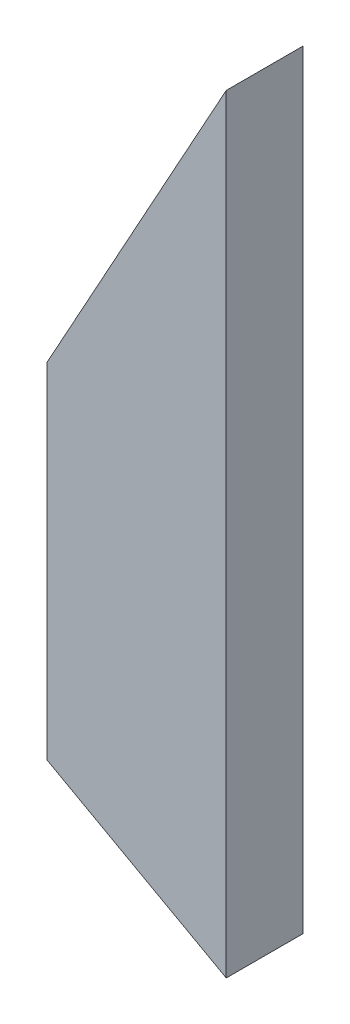
ISO-10303-21;
HEADER;
FILE_DESCRIPTION(('STEP AP214'),'2;1');
FILE_NAME('part.step','',(''),(''),'','','');
FILE_SCHEMA(('AUTOMOTIVE_DESIGN { 1 0 10303 214 1 1 1 1 }'));
ENDSEC;
DATA;
#1=APPLICATION_CONTEXT('core data for automotive mechanical design processes');
#2=APPLICATION_PROTOCOL_DEFINITION('international standard','automotive_design',2000,#1);
#3=PRODUCT_CONTEXT('',#1,'mechanical');
#4=PRODUCT('Part','Part','',(#3));
#5=PRODUCT_RELATED_PRODUCT_CATEGORY('part','',(#4));
#6=PRODUCT_DEFINITION_FORMATION('','',#4);
#7=PRODUCT_DEFINITION_CONTEXT('part definition',#1,'design');
#8=PRODUCT_DEFINITION('design','',#6,#7);
#9=PRODUCT_DEFINITION_SHAPE('','',#8);
#10=(LENGTH_UNIT() NAMED_UNIT(*) SI_UNIT(.MILLI.,.METRE.));
#11=(NAMED_UNIT(*) PLANE_ANGLE_UNIT() SI_UNIT($,.RADIAN.));
#12=(NAMED_UNIT(*) SI_UNIT($,.STERADIAN.) SOLID_ANGLE_UNIT());
#13=UNCERTAINTY_MEASURE_WITH_UNIT(LENGTH_MEASURE(1.E-05),#10,'distance_accuracy_value','');
#14=(GEOMETRIC_REPRESENTATION_CONTEXT(3) GLOBAL_UNCERTAINTY_ASSIGNED_CONTEXT((#13)) GLOBAL_UNIT_ASSIGNED_CONTEXT((#10,
#11,#12)) REPRESENTATION_CONTEXT('',''));
#15=CARTESIAN_POINT('',(0.,0.,0.));
#16=DIRECTION('',(0.,0.,1.));
#17=DIRECTION('',(1.,0.,0.));
#18=AXIS2_PLACEMENT_3D('',#15,#16,#17);
#19=CARTESIAN_POINT('',(-70.2792701901186,-127.022206747306,38.1));
#20=DIRECTION('',(-0.484122918275927,-0.875,0.));
#21=DIRECTION('',(0.875,-0.484122918275927,0.));
#22=AXIS2_PLACEMENT_3D('',#19,#20,#21);
#23=PLANE('',#22);
#24=DIRECTION('',(-0.875,0.484122918275927,0.));
#25=VECTOR('',#24,1.);
#26=CARTESIAN_POINT('',(-70.2792701901186,-127.022206747306,0.));
#27=LINE('',#26,#25);
#28=CARTESIAN_POINT('',(44.45,-190.5,0.));
#29=VERTEX_POINT('',#28);
#30=CARTESIAN_POINT('',(-44.45,-141.313111503166,0.));
#31=VERTEX_POINT('',#30);
#32=EDGE_CURVE('E101',#29,#31,#27,.T.);
#33=ORIENTED_EDGE('',*,*,#32,.F.);
#34=DIRECTION('',(0.,0.,-1.));
#35=VECTOR('',#34,1.);
#36=CARTESIAN_POINT('',(44.45,-190.5,38.1));
#37=LINE('',#36,#35);
#38=CARTESIAN_POINT('',(44.45,-190.5,38.1));
#39=VERTEX_POINT('',#38);
#40=EDGE_CURVE('E11',#39,#29,#37,.T.);
#41=ORIENTED_EDGE('',*,*,#40,.F.);
#42=DIRECTION('',(-0.875,0.484122918275927,0.));
#43=VECTOR('',#42,1.);
#44=CARTESIAN_POINT('',(-70.2792701901186,-127.022206747306,38.1));
#45=LINE('',#44,#43);
#46=CARTESIAN_POINT('',(-44.45,-141.313111503166,38.1));
#47=VERTEX_POINT('',#46);
#48=EDGE_CURVE('E95',#39,#47,#45,.T.);
#49=ORIENTED_EDGE('',*,*,#48,.T.);
#50=DIRECTION('',(0.,0.,-1.));
#51=VECTOR('',#50,1.);
#52=CARTESIAN_POINT('',(-44.45,-141.313111503166,38.1));
#53=LINE('',#52,#51);
#54=EDGE_CURVE('E76',#47,#31,#53,.T.);
#55=ORIENTED_EDGE('',*,*,#54,.T.);
#56=EDGE_LOOP('',(#33,#41,#49,#55));
#57=FACE_BOUND('',#56,.T.);
#58=ADVANCED_FACE('F38',(#57),#23,.T.);
#59=CARTESIAN_POINT('',(44.45,0.,38.1));
#60=DIRECTION('',(1.,0.,0.));
#61=DIRECTION('',(0.,1.,0.));
#62=AXIS2_PLACEMENT_3D('',#59,#60,#61);
#63=PLANE('',#62);
#64=DIRECTION('',(0.,-1.,0.));
#65=VECTOR('',#64,1.);
#66=CARTESIAN_POINT('',(44.45,0.,0.));
#67=LINE('',#66,#65);
#68=CARTESIAN_POINT('',(44.45,190.5,0.));
#69=VERTEX_POINT('',#68);
#70=EDGE_CURVE('E89',#69,#29,#67,.T.);
#71=ORIENTED_EDGE('',*,*,#70,.F.);
#72=DIRECTION('',(0.,0.,-1.));
#73=VECTOR('',#72,1.);
#74=CARTESIAN_POINT('',(44.45,190.5,38.1));
#75=LINE('',#74,#73);
#76=CARTESIAN_POINT('',(44.45,190.5,38.1));
#77=VERTEX_POINT('',#76);
#78=EDGE_CURVE('E46',#77,#69,#75,.T.);
#79=ORIENTED_EDGE('',*,*,#78,.F.);
#80=DIRECTION('',(0.,-1.,0.));
#81=VECTOR('',#80,1.);
#82=CARTESIAN_POINT('',(44.45,0.,38.1));
#83=LINE('',#82,#81);
#84=EDGE_CURVE('E87',#77,#39,#83,.T.);
#85=ORIENTED_EDGE('',*,*,#84,.T.);
#86=ORIENTED_EDGE('',*,*,#40,.T.);
#87=EDGE_LOOP('',(#71,#79,#85,#86));
#88=FACE_BOUND('',#87,.T.);
#89=ADVANCED_FACE('F85',(#88),#63,.T.);
#90=CARTESIAN_POINT('',(-46.4484536018245,25.6046850434427,38.1));
#91=DIRECTION('',(0.875753455117262,-0.482758620689655,0.));
#92=DIRECTION('',(0.482758620689655,0.875753455117262,0.));
#93=AXIS2_PLACEMENT_3D('',#90,#91,#92);
#94=PLANE('',#93);
#95=DIRECTION('',(-0.482758620689655,-0.875753455117262,0.));
#96=VECTOR('',#95,1.);
#97=CARTESIAN_POINT('',(-46.4484536018245,25.6046850434427,0.));
#98=LINE('',#97,#96);
#99=CARTESIAN_POINT('',(-44.45,29.2300012401563,0.));
#100=VERTEX_POINT('',#99);
#101=EDGE_CURVE('E69',#69,#100,#98,.T.);
#102=ORIENTED_EDGE('',*,*,#101,.T.);
#103=DIRECTION('',(0.,0.,-1.));
#104=VECTOR('',#103,1.);
#105=CARTESIAN_POINT('',(-44.45,29.2300012401563,38.1));
#106=LINE('',#105,#104);
#107=CARTESIAN_POINT('',(-44.45,29.2300012401563,38.1));
#108=VERTEX_POINT('',#107);
#109=EDGE_CURVE('E90',#108,#100,#106,.T.);
#110=ORIENTED_EDGE('',*,*,#109,.F.);
#111=DIRECTION('',(-0.482758620689655,-0.875753455117262,0.));
#112=VECTOR('',#111,1.);
#113=CARTESIAN_POINT('',(-46.4484536018245,25.6046850434427,38.1));
#114=LINE('',#113,#112);
#115=EDGE_CURVE('E91',#77,#108,#114,.T.);
#116=ORIENTED_EDGE('',*,*,#115,.F.);
#117=ORIENTED_EDGE('',*,*,#78,.T.);
#118=EDGE_LOOP('',(#102,#110,#116,#117));
#119=FACE_BOUND('',#118,.T.);
#120=ADVANCED_FACE('F92',(#119),#94,.F.);
#121=CARTESIAN_POINT('',(-44.45,0.,38.1));
#122=DIRECTION('',(1.,0.,0.));
#123=DIRECTION('',(0.,1.,0.));
#124=AXIS2_PLACEMENT_3D('',#121,#122,#123);
#125=PLANE('',#124);
#126=DIRECTION('',(0.,-1.,0.));
#127=VECTOR('',#126,1.);
#128=CARTESIAN_POINT('',(-44.45,0.,0.));
#129=LINE('',#128,#127);
#130=EDGE_CURVE('E97',#100,#31,#129,.T.);
#131=ORIENTED_EDGE('',*,*,#130,.T.);
#132=ORIENTED_EDGE('',*,*,#54,.F.);
#133=DIRECTION('',(0.,-1.,0.));
#134=VECTOR('',#133,1.);
#135=CARTESIAN_POINT('',(-44.45,0.,38.1));
#136=LINE('',#135,#134);
#137=EDGE_CURVE('E54',#108,#47,#136,.T.);
#138=ORIENTED_EDGE('',*,*,#137,.F.);
#139=ORIENTED_EDGE('',*,*,#109,.T.);
#140=EDGE_LOOP('',(#131,#132,#138,#139));
#141=FACE_BOUND('',#140,.T.);
#142=ADVANCED_FACE('F110',(#141),#125,.F.);
#143=CARTESIAN_POINT('',(0.,0.,38.1));
#144=DIRECTION('',(0.,0.,1.));
#145=DIRECTION('',(1.,0.,0.));
#146=AXIS2_PLACEMENT_3D('',#143,#144,#145);
#147=PLANE('',#146);
#148=ORIENTED_EDGE('',*,*,#48,.F.);
#149=ORIENTED_EDGE('',*,*,#84,.F.);
#150=ORIENTED_EDGE('',*,*,#115,.T.);
#151=ORIENTED_EDGE('',*,*,#137,.T.);
#152=EDGE_LOOP('',(#148,#149,#150,#151));
#153=FACE_BOUND('',#152,.T.);
#154=ADVANCED_FACE('F94',(#153),#147,.T.);
#155=CARTESIAN_POINT('',(0.,0.,0.));
#156=DIRECTION('',(0.,0.,1.));
#157=DIRECTION('',(1.,0.,0.));
#158=AXIS2_PLACEMENT_3D('',#155,#156,#157);
#159=PLANE('',#158);
#160=ORIENTED_EDGE('',*,*,#32,.T.);
#161=ORIENTED_EDGE('',*,*,#130,.F.);
#162=ORIENTED_EDGE('',*,*,#101,.F.);
#163=ORIENTED_EDGE('',*,*,#70,.T.);
#164=EDGE_LOOP('',(#160,#161,#162,#163));
#165=FACE_BOUND('',#164,.T.);
#166=ADVANCED_FACE('F112',(#165),#159,.F.);
#167=CLOSED_SHELL('',(#58,#89,#120,#142,#154,#166));
#168=MANIFOLD_SOLID_BREP('B2',#167);
#169=ADVANCED_BREP_SHAPE_REPRESENTATION('',(#18,#168),#14);
#170=SHAPE_DEFINITION_REPRESENTATION(#9,#169);
ENDSEC;
END-ISO-10303-21;
